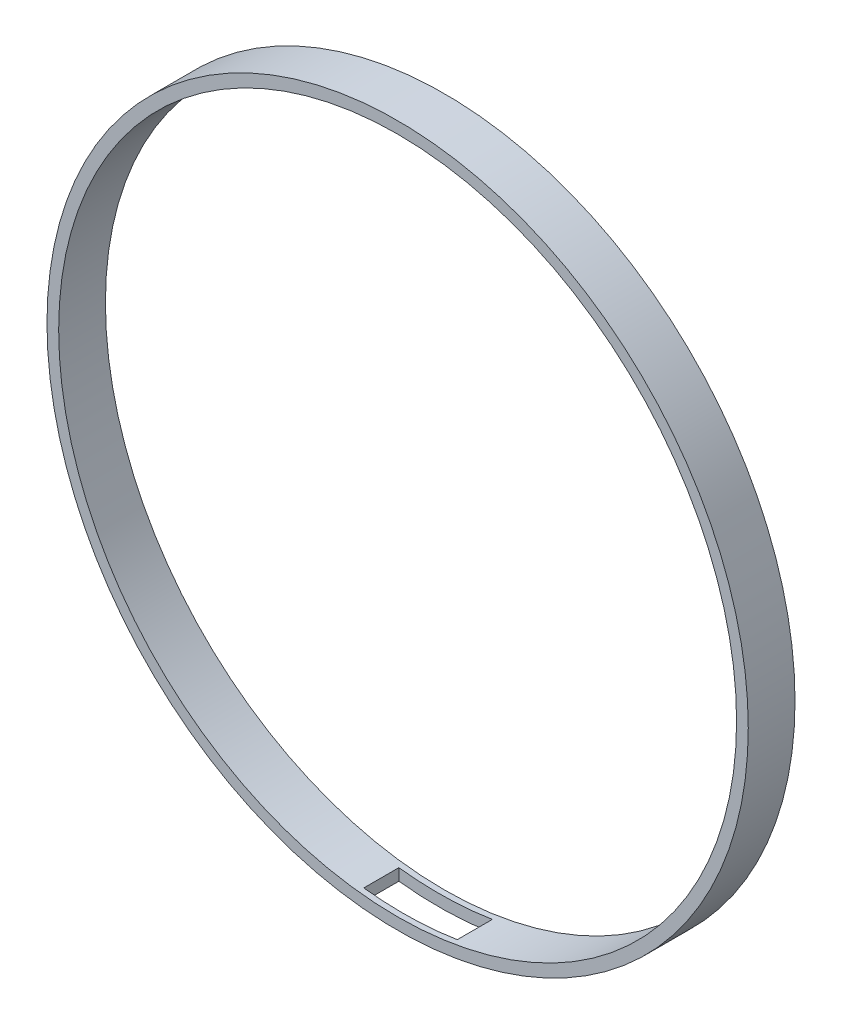
ISO-10303-21;
HEADER;
FILE_DESCRIPTION(('STEP AP214'),'2;1');
FILE_NAME('part.step','',(''),(''),'','','');
FILE_SCHEMA(('AUTOMOTIVE_DESIGN { 1 0 10303 214 1 1 1 1 }'));
ENDSEC;
DATA;
#1=APPLICATION_CONTEXT('core data for automotive mechanical design processes');
#2=APPLICATION_PROTOCOL_DEFINITION('international standard','automotive_design',2000,#1);
#3=PRODUCT_CONTEXT('',#1,'mechanical');
#4=PRODUCT('Part','Part','',(#3));
#5=PRODUCT_RELATED_PRODUCT_CATEGORY('part','',(#4));
#6=PRODUCT_DEFINITION_FORMATION('','',#4);
#7=PRODUCT_DEFINITION_CONTEXT('part definition',#1,'design');
#8=PRODUCT_DEFINITION('design','',#6,#7);
#9=PRODUCT_DEFINITION_SHAPE('','',#8);
#10=(LENGTH_UNIT() NAMED_UNIT(*) SI_UNIT(.MILLI.,.METRE.));
#11=(NAMED_UNIT(*) PLANE_ANGLE_UNIT() SI_UNIT($,.RADIAN.));
#12=(NAMED_UNIT(*) SI_UNIT($,.STERADIAN.) SOLID_ANGLE_UNIT());
#13=UNCERTAINTY_MEASURE_WITH_UNIT(LENGTH_MEASURE(1.E-05),#10,'distance_accuracy_value','');
#14=(GEOMETRIC_REPRESENTATION_CONTEXT(3) GLOBAL_UNCERTAINTY_ASSIGNED_CONTEXT((#13)) GLOBAL_UNIT_ASSIGNED_CONTEXT((#10,
#11,#12)) REPRESENTATION_CONTEXT('',''));
#15=CARTESIAN_POINT('',(0.,0.,0.));
#16=DIRECTION('',(0.,0.,1.));
#17=DIRECTION('',(1.,0.,0.));
#18=AXIS2_PLACEMENT_3D('',#15,#16,#17);
#19=CARTESIAN_POINT('',(0.,0.,25.4));
#20=DIRECTION('',(0.,0.,-1.));
#21=DIRECTION('',(-1.,0.,0.));
#22=AXIS2_PLACEMENT_3D('',#19,#20,#21);
#23=CYLINDRICAL_SURFACE('',#22,190.5);
#24=CARTESIAN_POINT('',(0.,0.,3.175));
#25=DIRECTION('',(0.,0.,-1.));
#26=DIRECTION('',(-1.,0.,0.));
#27=AXIS2_PLACEMENT_3D('',#24,#25,#26);
#28=CIRCLE('',#27,190.5);
#29=CARTESIAN_POINT('',(-21.5647447104442,-189.275491772108,3.175));
#30=VERTEX_POINT('',#29);
#31=CARTESIAN_POINT('',(29.2352552895558,-188.243326171619,3.175));
#32=VERTEX_POINT('',#31);
#33=EDGE_CURVE('E86',#30,#32,#28,.F.);
#34=ORIENTED_EDGE('',*,*,#33,.F.);
#35=DIRECTION('',(0.,0.,-1.));
#36=VECTOR('',#35,1.);
#37=CARTESIAN_POINT('',(-21.5647447104442,-189.275491772108,25.4));
#38=LINE('',#37,#36);
#39=CARTESIAN_POINT('',(-21.5647447104442,-189.275491772108,22.225));
#40=VERTEX_POINT('',#39);
#41=EDGE_CURVE('E93',#40,#30,#38,.T.);
#42=ORIENTED_EDGE('',*,*,#41,.F.);
#43=CARTESIAN_POINT('',(0.,0.,22.225));
#44=DIRECTION('',(0.,0.,1.));
#45=DIRECTION('',(1.,0.,0.));
#46=AXIS2_PLACEMENT_3D('',#43,#44,#45);
#47=CIRCLE('',#46,190.5);
#48=CARTESIAN_POINT('',(29.2352552895558,-188.243326171619,22.225));
#49=VERTEX_POINT('',#48);
#50=EDGE_CURVE('E98',#49,#40,#47,.F.);
#51=ORIENTED_EDGE('',*,*,#50,.F.);
#52=DIRECTION('',(0.,0.,-1.));
#53=VECTOR('',#52,1.);
#54=CARTESIAN_POINT('',(29.2352552895558,-188.243326171619,25.4));
#55=LINE('',#54,#53);
#56=EDGE_CURVE('E54',#32,#49,#55,.F.);
#57=ORIENTED_EDGE('',*,*,#56,.F.);
#58=EDGE_LOOP('',(#34,#42,#51,#57));
#59=FACE_BOUND('',#58,.T.);
#60=CARTESIAN_POINT('',(0.,0.,25.4));
#61=DIRECTION('',(0.,0.,1.));
#62=DIRECTION('',(1.,0.,0.));
#63=AXIS2_PLACEMENT_3D('',#60,#61,#62);
#64=CIRCLE('',#63,190.5);
#65=CARTESIAN_POINT('',(190.5,0.,25.4));
#66=VERTEX_POINT('',#65);
#67=EDGE_CURVE('E124',#66,#66,#64,.T.);
#68=ORIENTED_EDGE('',*,*,#67,.F.);
#69=EDGE_LOOP('',(#68));
#70=FACE_BOUND('',#69,.T.);
#71=CARTESIAN_POINT('',(0.,0.,0.));
#72=DIRECTION('',(0.,0.,1.));
#73=DIRECTION('',(1.,0.,0.));
#74=AXIS2_PLACEMENT_3D('',#71,#72,#73);
#75=CIRCLE('',#74,190.5);
#76=CARTESIAN_POINT('',(190.5,0.,0.));
#77=VERTEX_POINT('',#76);
#78=EDGE_CURVE('E120',#77,#77,#75,.T.);
#79=ORIENTED_EDGE('',*,*,#78,.T.);
#80=EDGE_LOOP('',(#79));
#81=FACE_BOUND('',#80,.T.);
#82=ADVANCED_FACE('F39',(#59,#70,#81),#23,.T.);
#83=CARTESIAN_POINT('',(0.,0.,25.4));
#84=DIRECTION('',(0.,0.,1.));
#85=DIRECTION('',(1.,0.,0.));
#86=AXIS2_PLACEMENT_3D('',#83,#84,#85);
#87=PLANE('',#86);
#88=CARTESIAN_POINT('',(0.,0.,25.4));
#89=DIRECTION('',(0.,0.,1.));
#90=DIRECTION('',(1.,0.,0.));
#91=AXIS2_PLACEMENT_3D('',#88,#89,#90);
#92=CIRCLE('',#91,184.15);
#93=CARTESIAN_POINT('',(184.15,0.,25.4));
#94=VERTEX_POINT('',#93);
#95=EDGE_CURVE('E104',#94,#94,#92,.T.);
#96=ORIENTED_EDGE('',*,*,#95,.F.);
#97=EDGE_LOOP('',(#96));
#98=FACE_BOUND('',#97,.T.);
#99=ORIENTED_EDGE('',*,*,#67,.T.);
#100=EDGE_LOOP('',(#99));
#101=FACE_BOUND('',#100,.T.);
#102=ADVANCED_FACE('F153',(#98,#101),#87,.T.);
#103=CARTESIAN_POINT('',(0.,0.,0.));
#104=DIRECTION('',(0.,0.,1.));
#105=DIRECTION('',(1.,0.,0.));
#106=AXIS2_PLACEMENT_3D('',#103,#104,#105);
#107=PLANE('',#106);
#108=CARTESIAN_POINT('',(0.,0.,0.));
#109=DIRECTION('',(0.,0.,1.));
#110=DIRECTION('',(1.,0.,0.));
#111=AXIS2_PLACEMENT_3D('',#108,#109,#110);
#112=CIRCLE('',#111,184.15);
#113=CARTESIAN_POINT('',(184.15,0.,0.));
#114=VERTEX_POINT('',#113);
#115=EDGE_CURVE('E116',#114,#114,#112,.T.);
#116=ORIENTED_EDGE('',*,*,#115,.T.);
#117=EDGE_LOOP('',(#116));
#118=FACE_BOUND('',#117,.T.);
#119=ORIENTED_EDGE('',*,*,#78,.F.);
#120=EDGE_LOOP('',(#119));
#121=FACE_BOUND('',#120,.T.);
#122=ADVANCED_FACE('F157',(#118,#121),#107,.F.);
#123=CARTESIAN_POINT('',(0.,0.,0.));
#124=DIRECTION('',(0.,0.,1.));
#125=DIRECTION('',(1.,0.,0.));
#126=AXIS2_PLACEMENT_3D('',#123,#124,#125);
#127=CYLINDRICAL_SURFACE('',#126,184.15);
#128=CARTESIAN_POINT('',(0.,0.,22.225));
#129=DIRECTION('',(0.,0.,1.));
#130=DIRECTION('',(1.,0.,0.));
#131=AXIS2_PLACEMENT_3D('',#128,#129,#130);
#132=CIRCLE('',#131,184.15);
#133=CARTESIAN_POINT('',(29.2352552895558,-181.814527329789,22.225));
#134=VERTEX_POINT('',#133);
#135=CARTESIAN_POINT('',(-21.5647447104442,-182.882979759116,22.225));
#136=VERTEX_POINT('',#135);
#137=EDGE_CURVE('E128',#134,#136,#132,.F.);
#138=ORIENTED_EDGE('',*,*,#137,.T.);
#139=DIRECTION('',(0.,0.,1.));
#140=VECTOR('',#139,1.);
#141=CARTESIAN_POINT('',(-21.5647447104442,-182.882979759116,0.));
#142=LINE('',#141,#140);
#143=CARTESIAN_POINT('',(-21.5647447104442,-182.882979759116,3.175));
#144=VERTEX_POINT('',#143);
#145=EDGE_CURVE('E11',#136,#144,#142,.F.);
#146=ORIENTED_EDGE('',*,*,#145,.T.);
#147=CARTESIAN_POINT('',(0.,0.,3.175));
#148=DIRECTION('',(0.,0.,-1.));
#149=DIRECTION('',(-1.,0.,0.));
#150=AXIS2_PLACEMENT_3D('',#147,#148,#149);
#151=CIRCLE('',#150,184.15);
#152=CARTESIAN_POINT('',(29.2352552895558,-181.814527329789,3.175));
#153=VERTEX_POINT('',#152);
#154=EDGE_CURVE('E47',#144,#153,#151,.F.);
#155=ORIENTED_EDGE('',*,*,#154,.T.);
#156=DIRECTION('',(0.,0.,1.));
#157=VECTOR('',#156,1.);
#158=CARTESIAN_POINT('',(29.2352552895558,-181.814527329789,0.));
#159=LINE('',#158,#157);
#160=EDGE_CURVE('E135',#153,#134,#159,.T.);
#161=ORIENTED_EDGE('',*,*,#160,.T.);
#162=EDGE_LOOP('',(#138,#146,#155,#161));
#163=FACE_BOUND('',#162,.T.);
#164=ORIENTED_EDGE('',*,*,#115,.F.);
#165=EDGE_LOOP('',(#164));
#166=FACE_BOUND('',#165,.T.);
#167=ORIENTED_EDGE('',*,*,#95,.T.);
#168=EDGE_LOOP('',(#167));
#169=FACE_BOUND('',#168,.T.);
#170=ADVANCED_FACE('F140',(#163,#166,#169),#127,.F.);
#171=CARTESIAN_POINT('',(-21.5647447104442,-190.501,3.175));
#172=DIRECTION('',(-1.,0.,0.));
#173=DIRECTION('',(0.,0.,1.));
#174=AXIS2_PLACEMENT_3D('',#171,#172,#173);
#175=PLANE('',#174);
#176=DIRECTION('',(0.,1.,0.));
#177=VECTOR('',#176,1.);
#178=CARTESIAN_POINT('',(-21.5647447104442,-190.501,22.225));
#179=LINE('',#178,#177);
#180=EDGE_CURVE('E62',#40,#136,#179,.T.);
#181=ORIENTED_EDGE('',*,*,#180,.F.);
#182=ORIENTED_EDGE('',*,*,#41,.T.);
#183=DIRECTION('',(0.,1.,0.));
#184=VECTOR('',#183,1.);
#185=CARTESIAN_POINT('',(-21.5647447104442,-190.501,3.175));
#186=LINE('',#185,#184);
#187=EDGE_CURVE('E81',#30,#144,#186,.T.);
#188=ORIENTED_EDGE('',*,*,#187,.T.);
#189=ORIENTED_EDGE('',*,*,#145,.F.);
#190=EDGE_LOOP('',(#181,#182,#188,#189));
#191=FACE_BOUND('',#190,.T.);
#192=ADVANCED_FACE('F94',(#191),#175,.F.);
#193=CARTESIAN_POINT('',(-21.5647447104442,-190.501,3.175));
#194=DIRECTION('',(0.,0.,-1.));
#195=DIRECTION('',(-1.,0.,0.));
#196=AXIS2_PLACEMENT_3D('',#193,#194,#195);
#197=PLANE('',#196);
#198=ORIENTED_EDGE('',*,*,#187,.F.);
#199=ORIENTED_EDGE('',*,*,#33,.T.);
#200=DIRECTION('',(0.,1.,0.));
#201=VECTOR('',#200,1.);
#202=CARTESIAN_POINT('',(29.2352552895558,-190.501,3.175));
#203=LINE('',#202,#201);
#204=EDGE_CURVE('E90',#32,#153,#203,.T.);
#205=ORIENTED_EDGE('',*,*,#204,.T.);
#206=ORIENTED_EDGE('',*,*,#154,.F.);
#207=EDGE_LOOP('',(#198,#199,#205,#206));
#208=FACE_BOUND('',#207,.T.);
#209=ADVANCED_FACE('F83',(#208),#197,.F.);
#210=CARTESIAN_POINT('',(29.2352552895558,-190.501,3.175));
#211=DIRECTION('',(1.,0.,0.));
#212=DIRECTION('',(0.,0.,-1.));
#213=AXIS2_PLACEMENT_3D('',#210,#211,#212);
#214=PLANE('',#213);
#215=ORIENTED_EDGE('',*,*,#204,.F.);
#216=ORIENTED_EDGE('',*,*,#56,.T.);
#217=DIRECTION('',(0.,1.,0.));
#218=VECTOR('',#217,1.);
#219=CARTESIAN_POINT('',(29.2352552895558,-190.501,22.225));
#220=LINE('',#219,#218);
#221=EDGE_CURVE('E108',#49,#134,#220,.T.);
#222=ORIENTED_EDGE('',*,*,#221,.T.);
#223=ORIENTED_EDGE('',*,*,#160,.F.);
#224=EDGE_LOOP('',(#215,#216,#222,#223));
#225=FACE_BOUND('',#224,.T.);
#226=ADVANCED_FACE('F143',(#225),#214,.F.);
#227=CARTESIAN_POINT('',(-21.5647447104442,-190.501,22.225));
#228=DIRECTION('',(0.,0.,1.));
#229=DIRECTION('',(1.,0.,0.));
#230=AXIS2_PLACEMENT_3D('',#227,#228,#229);
#231=PLANE('',#230);
#232=ORIENTED_EDGE('',*,*,#221,.F.);
#233=ORIENTED_EDGE('',*,*,#50,.T.);
#234=ORIENTED_EDGE('',*,*,#180,.T.);
#235=ORIENTED_EDGE('',*,*,#137,.F.);
#236=EDGE_LOOP('',(#232,#233,#234,#235));
#237=FACE_BOUND('',#236,.T.);
#238=ADVANCED_FACE('F142',(#237),#231,.F.);
#239=CLOSED_SHELL('',(#82,#102,#122,#170,#192,#209,#226,#238));
#240=MANIFOLD_SOLID_BREP('B2',#239);
#241=ADVANCED_BREP_SHAPE_REPRESENTATION('',(#18,#240),#14);
#242=SHAPE_DEFINITION_REPRESENTATION(#9,#241);
ENDSEC;
END-ISO-10303-21;
